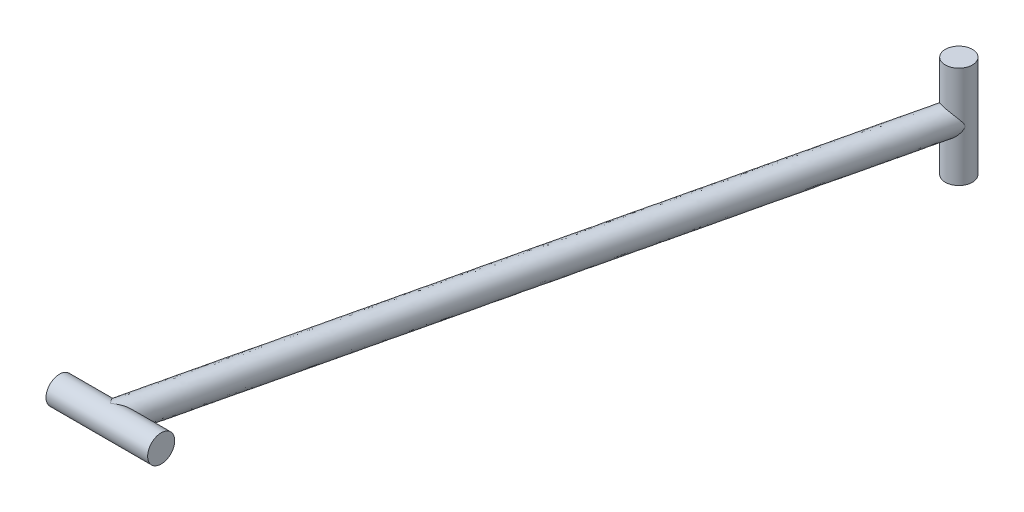
ISO-10303-21;
HEADER;
FILE_DESCRIPTION(('STEP AP214'),'2;1');
FILE_NAME('part.step','',(''),(''),'','','');
FILE_SCHEMA(('AUTOMOTIVE_DESIGN { 1 0 10303 214 1 1 1 1 }'));
ENDSEC;
DATA;
#1=APPLICATION_CONTEXT('core data for automotive mechanical design processes');
#2=APPLICATION_PROTOCOL_DEFINITION('international standard','automotive_design',2000,#1);
#3=PRODUCT_CONTEXT('',#1,'mechanical');
#4=PRODUCT('Part','Part','',(#3));
#5=PRODUCT_RELATED_PRODUCT_CATEGORY('part','',(#4));
#6=PRODUCT_DEFINITION_FORMATION('','',#4);
#7=PRODUCT_DEFINITION_CONTEXT('part definition',#1,'design');
#8=PRODUCT_DEFINITION('design','',#6,#7);
#9=PRODUCT_DEFINITION_SHAPE('','',#8);
#10=(LENGTH_UNIT() NAMED_UNIT(*) SI_UNIT(.MILLI.,.METRE.));
#11=(NAMED_UNIT(*) PLANE_ANGLE_UNIT() SI_UNIT($,.RADIAN.));
#12=(NAMED_UNIT(*) SI_UNIT($,.STERADIAN.) SOLID_ANGLE_UNIT());
#13=UNCERTAINTY_MEASURE_WITH_UNIT(LENGTH_MEASURE(1.E-05),#10,'distance_accuracy_value','');
#14=(GEOMETRIC_REPRESENTATION_CONTEXT(3) GLOBAL_UNCERTAINTY_ASSIGNED_CONTEXT((#13)) GLOBAL_UNIT_ASSIGNED_CONTEXT((#10,
#11,#12)) REPRESENTATION_CONTEXT('',''));
#15=CARTESIAN_POINT('',(0.,0.,0.));
#16=DIRECTION('',(0.,0.,1.));
#17=DIRECTION('',(1.,0.,0.));
#18=AXIS2_PLACEMENT_3D('',#15,#16,#17);
#19=CARTESIAN_POINT('',(23.8512363432151,-7.5,-101.371880346081));
#20=DIRECTION('',(0.,1.,0.));
#21=DIRECTION('',(-1.,0.,0.));
#22=AXIS2_PLACEMENT_3D('',#19,#20,#21);
#23=CYLINDRICAL_SURFACE('',#22,2.);
#24=CARTESIAN_POINT('',(25.8512363432151,0.,-101.371880346081));
#25=VERTEX_POINT('',#24);
#26=VERTEX_LOOP('',#25);
#27=FACE_BOUND('',#26,.T.);
#28=CARTESIAN_POINT('',(23.8512363432151,-7.5,-101.371880346081));
#29=DIRECTION('',(0.,1.,0.));
#30=DIRECTION('',(-1.,0.,0.));
#31=AXIS2_PLACEMENT_3D('',#28,#29,#30);
#32=CIRCLE('',#31,2.);
#33=CARTESIAN_POINT('',(21.8512363432151,-7.5,-101.371880346081));
#34=VERTEX_POINT('',#33);
#35=EDGE_CURVE('E125',#34,#34,#32,.T.);
#36=ORIENTED_EDGE('',*,*,#35,.T.);
#37=EDGE_LOOP('',(#36));
#38=FACE_BOUND('',#37,.T.);
#39=CARTESIAN_POINT('',(23.8512363432151,7.5,-101.371880346081));
#40=DIRECTION('',(0.,1.,0.));
#41=DIRECTION('',(-1.,0.,0.));
#42=AXIS2_PLACEMENT_3D('',#39,#40,#41);
#43=CIRCLE('',#42,2.);
#44=CARTESIAN_POINT('',(21.8512363432151,7.5,-101.371880346081));
#45=VERTEX_POINT('',#44);
#46=EDGE_CURVE('E106',#45,#45,#43,.T.);
#47=ORIENTED_EDGE('',*,*,#46,.F.);
#48=EDGE_LOOP('',(#47));
#49=FACE_BOUND('',#48,.T.);
#50=CARTESIAN_POINT('',(25.6414164622059,0.,-100.480109556264));
#51=CARTESIAN_POINT('',(25.6414164896629,0.0330633130119497,-100.480109685598));
#52=CARTESIAN_POINT('',(25.6398297808977,0.0661271028455549,-100.476903879545));
#53=CARTESIAN_POINT('',(25.6338354164729,0.131099321924574,-100.465028855595));
#54=CARTESIAN_POINT('',(25.6294108859467,0.162999625216193,-100.456326960425));
#55=CARTESIAN_POINT('',(25.6182129756447,0.22615370066255,-100.43489406543));
#56=CARTESIAN_POINT('',(25.611364280809,0.257347828838784,-100.422035180611));
#57=CARTESIAN_POINT('',(25.5959016096659,0.318207313060219,-100.393922461357));
#58=CARTESIAN_POINT('',(25.5872843337629,0.347869679961049,-100.378664163022));
#59=CARTESIAN_POINT('',(25.5685825412208,0.40609216080435,-100.34666431721));
#60=CARTESIAN_POINT('',(25.5584909005276,0.434646018597986,-100.329915731781));
#61=CARTESIAN_POINT('',(25.5370655069417,0.490784072258759,-100.295595006165));
#62=CARTESIAN_POINT('',(25.5257312402196,0.518367860725302,-100.278022527028));
#63=CARTESIAN_POINT('',(25.5009043937179,0.575117644919343,-100.240891168043));
#64=CARTESIAN_POINT('',(25.4873098387017,0.604212664892045,-100.221292426204));
#65=CARTESIAN_POINT('',(25.4588772043875,0.661647269649031,-100.181887745201));
#66=CARTESIAN_POINT('',(25.4440389343604,0.689986737684641,-100.162081774666));
#67=CARTESIAN_POINT('',(25.3977156558814,0.774076112986543,-100.102659748105));
#68=CARTESIAN_POINT('',(25.3644376398722,0.828862269182463,-100.063063069661));
#69=CARTESIAN_POINT('',(25.2933773128712,0.936086930855972,-99.9851546209353));
#70=CARTESIAN_POINT('',(25.2556076837358,0.988531496985108,-99.9468396067338));
#71=CARTESIAN_POINT('',(25.1755246227171,1.09121673022868,-99.8721276434021));
#72=CARTESIAN_POINT('',(25.13321313935,1.14145832951863,-99.8357298816566));
#73=CARTESIAN_POINT('',(25.0106341837346,1.27627484190168,-99.7391990115311));
#74=CARTESIAN_POINT('',(24.92561495809,1.35847569745479,-99.6816351775219));
#75=CARTESIAN_POINT('',(24.7412537820917,1.51347328446554,-99.5777104739691));
#76=CARTESIAN_POINT('',(24.6419272370711,1.586279973204,-99.5313376963897));
#77=CARTESIAN_POINT('',(24.4566912214054,1.70174008261779,-99.4638738948813));
#78=CARTESIAN_POINT('',(24.3738827119407,1.74733625607209,-99.439348773381));
#79=CARTESIAN_POINT('',(24.2014406092943,1.82914438674591,-99.4008069383552));
#80=CARTESIAN_POINT('',(24.1118166333109,1.86536926100591,-99.3867757094239));
#81=CARTESIAN_POINT('',(23.9422840268453,1.92123557432444,-99.3724430681944));
#82=CARTESIAN_POINT('',(23.8631038912654,1.94259997767473,-99.3703096715738));
#83=CARTESIAN_POINT('',(23.7030660868549,1.97570570071809,-99.3757739966267));
#84=CARTESIAN_POINT('',(23.6222094446811,1.98745274125164,-99.3833659263346));
#85=CARTESIAN_POINT('',(23.4609348711303,2.00048085693559,-99.4086315615333));
#86=CARTESIAN_POINT('',(23.3805192308502,2.00172767086771,-99.4263380694187));
#87=CARTESIAN_POINT('',(23.2229866475399,1.9935628518087,-99.4713503463768));
#88=CARTESIAN_POINT('',(23.1458700643559,1.98415005917641,-99.4986571596281));
#89=CARTESIAN_POINT('',(23.0008526232865,1.95611522798826,-99.5600449493896));
#90=CARTESIAN_POINT('',(22.9326843305949,1.93797347519617,-99.5937224208468));
#91=CARTESIAN_POINT('',(22.8024647668539,1.89378381594142,-99.6672753008752));
#92=CARTESIAN_POINT('',(22.740420849738,1.86772655421533,-99.7071580160061));
#93=CARTESIAN_POINT('',(22.6408259289404,1.81782052448513,-99.7789382538994));
#94=CARTESIAN_POINT('',(22.6015213417867,1.79566523636326,-99.8096289697726));
#95=CARTESIAN_POINT('',(22.5263269794008,1.74853549898356,-99.872872278598));
#96=CARTESIAN_POINT('',(22.4904341509944,1.7235636149033,-99.9054231643046));
#97=CARTESIAN_POINT('',(22.3876750720484,1.64485574178421,-100.005447263154));
#98=CARTESIAN_POINT('',(22.3258532692708,1.58739248186293,-100.075199397426));
#99=CARTESIAN_POINT('',(22.193790583975,1.44162126804772,-100.245586332518));
#100=CARTESIAN_POINT('',(22.1293899197793,1.34992772153495,-100.347819554426));
#101=CARTESIAN_POINT('',(22.0491803803215,1.20494742461934,-100.502410853279));
#102=CARTESIAN_POINT('',(22.0251543544892,1.15530822264227,-100.554219352363));
#103=CARTESIAN_POINT('',(21.9822412576117,1.05376056711014,-100.657743240233));
#104=CARTESIAN_POINT('',(21.963352526476,1.00185285292152,-100.70945865372));
#105=CARTESIAN_POINT('',(21.9338605905439,0.907007100286012,-100.801367396172));
#106=CARTESIAN_POINT('',(21.9223503455336,0.86447724152798,-100.841697581549));
#107=CARTESIAN_POINT('',(21.9021664034404,0.777949732967088,-100.921523592375));
#108=CARTESIAN_POINT('',(21.8934938517243,0.73395149836598,-100.961019074913));
#109=CARTESIAN_POINT('',(21.8788290947928,0.644343912598489,-101.038481547172));
#110=CARTESIAN_POINT('',(21.8728312857652,0.598738147865237,-101.076451579421));
#111=CARTESIAN_POINT('',(21.865652049047,0.528653929329881,-101.131466714281));
#112=CARTESIAN_POINT('',(21.8635623519017,0.505022965397859,-101.149475015373));
#113=CARTESIAN_POINT('',(21.8599454896835,0.457071410239245,-101.184604380358));
#114=CARTESIAN_POINT('',(21.858418226635,0.432750939919934,-101.201725598333));
#115=CARTESIAN_POINT('',(21.8553547245486,0.373143728383263,-101.241504981005));
#116=CARTESIAN_POINT('',(21.8540700286709,0.337438208318554,-101.263565530174));
#117=CARTESIAN_POINT('',(21.8523011296765,0.263771585135846,-101.303637557736));
#118=CARTESIAN_POINT('',(21.8518154437818,0.225814795844698,-101.321656482634));
#119=CARTESIAN_POINT('',(21.8513721615968,0.158970404662672,-101.346375695456));
#120=CARTESIAN_POINT('',(21.8513001067132,0.130763378886722,-101.35484930148));
#121=CARTESIAN_POINT('',(21.8512325204918,0.0733687412123095,-101.36701368639));
#122=CARTESIAN_POINT('',(21.8512367440805,0.0441845703223844,-101.370719741743));
#123=CARTESIAN_POINT('',(21.8512359680219,-0.01453680441229,-101.372574077925));
#124=CARTESIAN_POINT('',(21.8512309161016,-0.0440750713287584,-101.370690822774));
#125=CARTESIAN_POINT('',(21.8512578222769,-0.102382929144676,-101.361738537585));
#126=CARTESIAN_POINT('',(21.8512898769814,-0.131150313120694,-101.354655988525));
#127=CARTESIAN_POINT('',(21.8515040220253,-0.181788834815861,-101.338378304777));
#128=CARTESIAN_POINT('',(21.8516551143533,-0.203896684414685,-101.329880162518));
#129=CARTESIAN_POINT('',(21.8521407931181,-0.247301824660974,-101.311001875697));
#130=CARTESIAN_POINT('',(21.8524755319634,-0.268598426331823,-101.300620172763));
#131=CARTESIAN_POINT('',(21.8533898450298,-0.310537589757773,-101.278428599797));
#132=CARTESIAN_POINT('',(21.8539704965909,-0.331176838651411,-101.266612610657));
#133=CARTESIAN_POINT('',(21.8554226810484,-0.371807695422043,-101.241954467136));
#134=CARTESIAN_POINT('',(21.8562941277043,-0.391799493386178,-101.229112617851));
#135=CARTESIAN_POINT('',(21.8590258893691,-0.443857569873749,-101.194204365618));
#136=CARTESIAN_POINT('',(21.86116222872,-0.475472860510501,-101.171488941949));
#137=CARTESIAN_POINT('',(21.8664275804825,-0.537617032690497,-101.12471602923));
#138=CARTESIAN_POINT('',(21.8695570714889,-0.568145382537405,-101.100657897751));
#139=CARTESIAN_POINT('',(21.8768922842518,-0.628369420676744,-101.051596743545));
#140=CARTESIAN_POINT('',(21.8810994919512,-0.658063895998619,-101.026592457169));
#141=CARTESIAN_POINT('',(21.8906497458481,-0.716717333594742,-100.975944131473));
#142=CARTESIAN_POINT('',(21.895992942906,-0.74567619760673,-100.950300007581));
#143=CARTESIAN_POINT('',(21.9138302619363,-0.831698329931916,-100.872599655411));
#144=CARTESIAN_POINT('',(21.9281188155123,-0.887795241216367,-100.81986883412));
#145=CARTESIAN_POINT('',(21.9618246415138,-0.997606029852399,-100.713676643988));
#146=CARTESIAN_POINT('',(21.9812378486254,-1.05132175688783,-100.660215885933));
#147=CARTESIAN_POINT('',(22.0267555609819,-1.15916418616672,-100.550302488454));
#148=CARTESIAN_POINT('',(22.0531627453682,-1.21315882662256,-100.493842955466));
#149=CARTESIAN_POINT('',(22.11248832687,-1.31809445657913,-100.381524608059));
#150=CARTESIAN_POINT('',(22.1454098153901,-1.36903398124135,-100.325666092177));
#151=CARTESIAN_POINT('',(22.2543878276713,-1.51600772814544,-100.160536231729));
#152=CARTESIAN_POINT('',(22.340935007836,-1.6068949213317,-100.052994648646));
#153=CARTESIAN_POINT('',(22.5004225512203,-1.73223217298269,-99.8947335789992));
#154=CARTESIAN_POINT('',(22.5631612041835,-1.77412723287512,-99.8394944250851));
#155=CARTESIAN_POINT('',(22.6985893217725,-1.84894565019525,-99.7352166660919));
#156=CARTESIAN_POINT('',(22.7712738716604,-1.88187341490558,-99.6861750214112));
#157=CARTESIAN_POINT('',(22.887350835103,-1.92304000139374,-99.6188930236413));
#158=CARTESIAN_POINT('',(22.9274543372925,-1.93543561513494,-99.5974137228463));
#159=CARTESIAN_POINT('',(23.0097008951446,-1.95713972089325,-99.556966202197));
#160=CARTESIAN_POINT('',(23.0518428261892,-1.96644989340579,-99.5379966188109));
#161=CARTESIAN_POINT('',(23.1378371569078,-1.9817653316971,-99.5028654467819));
#162=CARTESIAN_POINT('',(23.1816884942766,-1.98777261605786,-99.4867021472026));
#163=CARTESIAN_POINT('',(23.2707048000639,-1.99634658835593,-99.4574136257441));
#164=CARTESIAN_POINT('',(23.3158695662887,-1.99891380303404,-99.4442879390027));
#165=CARTESIAN_POINT('',(23.4402440767364,-2.00110997591624,-99.4128869924573));
#166=CARTESIAN_POINT('',(23.5203702420451,-1.99725370641019,-99.3977891576926));
#167=CARTESIAN_POINT('',(23.6806674150554,-1.97931955668715,-99.3775256278309));
#168=CARTESIAN_POINT('',(23.7608384255553,-1.96524094512834,-99.372360643461));
#169=CARTESIAN_POINT('',(23.9167402683661,-1.92841221978288,-99.3714768974999));
#170=CARTESIAN_POINT('',(23.9925325097181,-1.90592184366401,-99.3754919891986));
#171=CARTESIAN_POINT('',(24.1405664126012,-1.85349818634133,-99.3915161268252));
#172=CARTESIAN_POINT('',(24.212806933613,-1.82356253278511,-99.4035277227972));
#173=CARTESIAN_POINT('',(24.385730572449,-1.74197899487784,-99.4417461958544));
#174=CARTESIAN_POINT('',(24.4838326074107,-1.68673771109214,-99.4719708429538));
#175=CARTESIAN_POINT('',(24.6691715333106,-1.56629776448547,-99.5440614904245));
#176=CARTESIAN_POINT('',(24.756377499942,-1.50107188003319,-99.5859595809886));
#177=CARTESIAN_POINT('',(24.8945933282351,-1.38432310570896,-99.6643535806901));
#178=CARTESIAN_POINT('',(24.948532758408,-1.33468523000336,-99.6986020660752));
#179=CARTESIAN_POINT('',(25.0510487712397,-1.23240290219126,-99.7705149870878));
#180=CARTESIAN_POINT('',(25.0996237333861,-1.17975754882551,-99.8081804486998));
#181=CARTESIAN_POINT('',(25.1914016304663,-1.07191480816491,-99.8860892952446));
#182=CARTESIAN_POINT('',(25.2346103938422,-1.01672028065607,-99.9263298100095));
#183=CARTESIAN_POINT('',(25.3157621285002,-0.903832164618239,-100.008611464032));
#184=CARTESIAN_POINT('',(25.3537034951579,-0.84613782155455,-100.050653146905));
#185=CARTESIAN_POINT('',(25.4200911487283,-0.734943171382799,-100.130486815443));
#186=CARTESIAN_POINT('',(25.4491289465506,-0.68174142804855,-100.168200814423));
#187=CARTESIAN_POINT('',(25.4893143796403,-0.599929276978173,-100.224173778835));
#188=CARTESIAN_POINT('',(25.5021424008579,-0.572337096096337,-100.242723171139));
#189=CARTESIAN_POINT('',(25.5266062300812,-0.516316163463138,-100.279351597522));
#190=CARTESIAN_POINT('',(25.538242045575,-0.48788741696771,-100.297430634555));
#191=CARTESIAN_POINT('',(25.5570557587924,-0.438251221395393,-100.327657736877));
#192=CARTESIAN_POINT('',(25.5645576446342,-0.417300600209389,-100.340024846713));
#193=CARTESIAN_POINT('',(25.5788085723921,-0.374758034971738,-100.364066334845));
#194=CARTESIAN_POINT('',(25.5855577975705,-0.353166248663301,-100.375740881447));
#195=CARTESIAN_POINT('',(25.5981891174925,-0.30921830564263,-100.398063023031));
#196=CARTESIAN_POINT('',(25.6040717406282,-0.286862625029668,-100.408711242414));
#197=CARTESIAN_POINT('',(25.6148015996771,-0.24126403000401,-100.428501144219));
#198=CARTESIAN_POINT('',(25.6196495304625,-0.218021723468872,-100.437643836764));
#199=CARTESIAN_POINT('',(25.6293829546324,-0.16319608301723,-100.456273243452));
#200=CARTESIAN_POINT('',(25.633818102221,-0.131252673006746,-100.46499497954));
#201=CARTESIAN_POINT('',(25.6398260899096,-0.0662007265207565,-100.476896126455));
#202=CARTESIAN_POINT('',(25.641416434718,-0.0331006022092744,-100.480109426784));
#203=CARTESIAN_POINT('',(25.6414164622059,0.,-100.480109556264));
#204=B_SPLINE_CURVE_WITH_KNOTS('',3,(#50,#51,#52,#53,#54,#55,#56,#57,#58,#59,#60,#61,#62,#63,
#64,#65,#66,#67,#68,#69,#70,#71,#72,#73,#74,#75,#76,#77,#78,#79,#80,#81,#82,#83,#84,#85,#86,#87,
#88,#89,#90,#91,#92,#93,#94,#95,#96,#97,#98,#99,#100,#101,#102,#103,#104,#105,#106,#107,#108,
#109,#110,#111,#112,#113,#114,#115,#116,#117,#118,#119,#120,#121,#122,#123,#124,#125,#126,#127,
#128,#129,#130,#131,#132,#133,#134,#135,#136,#137,#138,#139,#140,#141,#142,#143,#144,#145,#146,
#147,#148,#149,#150,#151,#152,#153,#154,#155,#156,#157,#158,#159,#160,#161,#162,#163,#164,#165,
#166,#167,#168,#169,#170,#171,#172,#173,#174,#175,#176,#177,#178,#179,#180,#181,#182,#183,#184,
#185,#186,#187,#188,#189,#190,#191,#192,#193,#194,#195,#196,#197,#198,#199,#200,#201,#202,#203),
.UNSPECIFIED.,.T.,.F.,(4,2,2,2,2,2,2,2,2,2,2,2,2,2,2,2,2,2,2,2,2,2,2,2,2,2,2,2,2,2,2,2,2,2,2,2,
2,2,2,2,2,2,2,2,2,2,2,2,2,2,2,2,2,2,2,2,2,2,2,2,2,2,2,2,2,2,2,2,2,2,2,2,2,2,2,2,4),(0.,
0.0990434605695672,0.198681404838483,0.301734735919303,0.404982107769672,0.508745961866879,
0.61255288561044,0.725386043902423,0.838236537410784,1.06407124957604,1.28928282636853,
1.51439816763924,1.90759602723141,2.30037363465985,2.59232510049995,2.88387198130991,
3.12894748404239,3.37387709869241,3.61960558646405,3.8653608092037,4.09891808839242,
4.33275248780027,4.4962474671304,4.65959472989868,4.98678838133903,5.43926482201365,
5.66611960267548,5.89290098904243,6.0720109339905,6.25119308344739,6.42999804695031,
6.51932969616771,6.60864577650143,6.73447284783371,6.86006614868269,6.94811730007276,
7.03588560421349,7.12415005393378,7.21264482235421,7.28359898372849,7.35461211934179,
7.42593963423194,7.49724601443106,7.61413573855463,7.73108187701015,7.84819013555353,
7.96531395590972,8.19999960235473,8.43449963262687,8.68155863882773,8.92873517086058,
9.42001654769625,9.6996429999009,9.97913177111372,10.120411365752,10.2616138850583,
10.4027300113109,10.5438245275017,10.7873311452642,11.0308551860517,11.2674088641937,
11.5040380142422,11.8518299107155,12.2005874809715,12.443016928878,12.6855194113301,
12.927756154847,13.1700665305726,13.384039924669,13.4909260529089,13.597811509753,
13.6741660636802,13.7505019855594,13.8267911688582,13.9030289560064,14.0028001733479,
14.1019553363093),.UNSPECIFIED.);
#205=CARTESIAN_POINT('',(25.6414164622059,0.,-100.480109556264));
#206=VERTEX_POINT('',#205);
#207=EDGE_CURVE('E75',#206,#206,#204,.T.);
#208=ORIENTED_EDGE('',*,*,#207,.F.);
#209=EDGE_LOOP('',(#208));
#210=FACE_BOUND('',#209,.T.);
#211=ADVANCED_FACE('F45',(#27,#38,#49,#210),#23,.T.);
#212=CARTESIAN_POINT('',(23.8512363432151,-7.5,-101.371880346081));
#213=DIRECTION('',(0.,1.,0.));
#214=DIRECTION('',(-1.,0.,0.));
#215=AXIS2_PLACEMENT_3D('',#212,#213,#214);
#216=PLANE('',#215);
#217=ORIENTED_EDGE('',*,*,#35,.F.);
#218=EDGE_LOOP('',(#217));
#219=FACE_BOUND('',#218,.T.);
#220=ADVANCED_FACE('F79',(#219),#216,.F.);
#221=CARTESIAN_POINT('',(23.8512363432151,7.5,-101.371880346081));
#222=DIRECTION('',(0.,1.,0.));
#223=DIRECTION('',(-1.,0.,0.));
#224=AXIS2_PLACEMENT_3D('',#221,#222,#223);
#225=PLANE('',#224);
#226=ORIENTED_EDGE('',*,*,#46,.T.);
#227=EDGE_LOOP('',(#226));
#228=FACE_BOUND('',#227,.T.);
#229=ADVANCED_FACE('F77',(#228),#225,.T.);
#230=CARTESIAN_POINT('',(2.,0.,0.));
#231=CARTESIAN_POINT('',(25.8512363432151,0.,-101.371880346081));
#232=CARTESIAN_POINT('',(2.,4.,0.));
#233=CARTESIAN_POINT('',(25.8512363432151,4.,-101.371880346081));
#234=CARTESIAN_POINT('',(-2.,4.,0.));
#235=CARTESIAN_POINT('',(21.8512363432151,4.,-101.371880346081));
#236=CARTESIAN_POINT('',(-2.,0.,0.));
#237=CARTESIAN_POINT('',(21.8512363432151,0.,-101.371880346081));
#238=CARTESIAN_POINT('',(-2.,-4.,0.));
#239=CARTESIAN_POINT('',(21.8512363432151,-4.,-101.371880346081));
#240=CARTESIAN_POINT('',(2.,-4.,0.));
#241=CARTESIAN_POINT('',(25.8512363432151,-4.,-101.371880346081));
#242=CARTESIAN_POINT('',(2.,0.,0.));
#243=CARTESIAN_POINT('',(25.8512363432151,0.,-101.371880346081));
#244=(BOUNDED_SURFACE() B_SPLINE_SURFACE(3,1,((#230,#231),(#232,#233),(#234,#235),(#236,#237),
(#238,#239),(#240,#241),(#242,#243)),.UNSPECIFIED.,.T.,.F.,.F.) B_SPLINE_SURFACE_WITH_KNOTS((4,
3,4),(2,2),(0.,0.5,1.),(0.,1.),
.UNSPECIFIED.) GEOMETRIC_REPRESENTATION_ITEM() RATIONAL_B_SPLINE_SURFACE(((1.,1.),
(0.333333333333333,0.333333333333333),(0.333333333333333,0.333333333333333),(1.,1.),
(0.333333333333333,0.333333333333333),(0.333333333333333,0.333333333333333),(1.,1.))) REPRESENTATION_ITEM('') SURFACE());
#245=CARTESIAN_POINT('',(0.,-2.,0.));
#246=CARTESIAN_POINT('',(0.00234955513881044,-1.99999999579181,-0.00190203557211533));
#247=CARTESIAN_POINT('',(0.00469913541317584,-1.99999728267501,-0.00380409149221877));
#248=CARTESIAN_POINT('',(0.114305847395802,-1.99974431551953,-0.0925340224012214));
#249=CARTESIAN_POINT('',(0.221605963155561,-1.99385029488185,-0.179396694272455));
#250=CARTESIAN_POINT('',(0.435533626753908,-1.97061731010082,-0.352577574056759));
#251=CARTESIAN_POINT('',(0.542160474227306,-1.95326794288155,-0.438895215003144));
#252=CARTESIAN_POINT('',(0.75399354030323,-1.90665700219048,-0.610380455056205));
#253=CARTESIAN_POINT('',(0.859197799890242,-1.87738044869279,-0.695546468280848));
#254=CARTESIAN_POINT('',(1.06691720227247,-1.80619737040046,-0.863701573827866));
#255=CARTESIAN_POINT('',(1.16943473123542,-1.76430249618628,-0.946692597824771));
#256=CARTESIAN_POINT('',(1.37823177649764,-1.66301554170228,-1.11572008772201));
#257=CARTESIAN_POINT('',(1.48419499935633,-1.60252628288114,-1.20150050456425));
#258=CARTESIAN_POINT('',(1.68879949680379,-1.46376085577807,-1.36713400084901));
#259=CARTESIAN_POINT('',(1.78745377944107,-1.38551734596174,-1.44699761069812));
#260=CARTESIAN_POINT('',(1.95096747029362,-1.23018515465675,-1.57936686281708));
#261=CARTESIAN_POINT('',(2.01824774622282,-1.15734599331362,-1.63383227033467));
#262=CARTESIAN_POINT('',(2.14331923004924,-0.999137436488175,-1.73508139931619));
#263=CARTESIAN_POINT('',(2.20112540831798,-0.913788220938408,-1.78187723974626));
#264=CARTESIAN_POINT('',(2.28960464033582,-0.754959309871377,-1.85350383999673));
#265=CARTESIAN_POINT('',(2.32340371136049,-0.684372909833265,-1.88086520484923));
#266=CARTESIAN_POINT('',(2.3817481156476,-0.537023356085348,-1.92809675543377));
#267=CARTESIAN_POINT('',(2.40630112231192,-0.460265388714408,-1.94797315301546));
#268=CARTESIAN_POINT('',(2.43481334116963,-0.341472496961224,-1.97105465198179));
#269=CARTESIAN_POINT('',(2.44295116519852,-0.301048566153884,-1.97764246536263));
#270=CARTESIAN_POINT('',(2.45618506138068,-0.219392147790795,-1.98835570246895));
#271=CARTESIAN_POINT('',(2.46128267146704,-0.178160079964029,-1.99248237119754));
#272=CARTESIAN_POINT('',(2.46829827471774,-0.0952622909830991,-1.9981617130962));
#273=CARTESIAN_POINT('',(2.47021736660834,-0.0535967246911198,-1.99971527571824));
#274=CARTESIAN_POINT('',(2.47083306251864,0.029760033811994,-2.00021370008106));
#275=CARTESIAN_POINT('',(2.46953000722866,0.0714512228479476,-1.9991588376209));
#276=CARTESIAN_POINT('',(2.46159086055835,0.1849065443484,-1.99273185953898));
#277=CARTESIAN_POINT('',(2.4517483118717,0.256336944772661,-1.98476402026023));
#278=CARTESIAN_POINT('',(2.42321001250166,0.396140146688179,-1.96166140833437));
#279=CARTESIAN_POINT('',(2.404510533497,0.464511647259032,-1.94652361749901));
#280=CARTESIAN_POINT('',(2.35297266675574,0.61608021842675,-1.90480216383522));
#281=CARTESIAN_POINT('',(2.31761037552674,0.697854695606116,-1.87617532519706));
#282=CARTESIAN_POINT('',(2.23706669291774,0.852931844130472,-1.81097279093716));
#283=CARTESIAN_POINT('',(2.191867585893,0.926218860291071,-1.77438275396802));
#284=CARTESIAN_POINT('',(2.07264114293744,1.09447665043642,-1.67786536142141));
#285=CARTESIAN_POINT('',(1.99467874201404,1.18480457177616,-1.61475245234429));
#286=CARTESIAN_POINT('',(1.82884575938038,1.34884444519679,-1.48050566375398));
#287=CARTESIAN_POINT('',(1.74095358510599,1.42251909911982,-1.4093543044105));
#288=CARTESIAN_POINT('',(1.5794861170742,1.53977696535873,-1.27864153122286));
#289=CARTESIAN_POINT('',(1.50721207693169,1.5863915959796,-1.22013352133043));
#290=CARTESIAN_POINT('',(1.35978289916807,1.67142000813592,-1.10078516646712));
#291=CARTESIAN_POINT('',(1.28462650717473,1.70983017027933,-1.0399438060442));
#292=CARTESIAN_POINT('',(1.13219896349268,1.77902858529836,-0.916549123593926));
#293=CARTESIAN_POINT('',(1.05492678163604,1.80981304924559,-0.85399496761462));
#294=CARTESIAN_POINT('',(0.898865093231656,1.86420012813593,-0.727658335673244));
#295=CARTESIAN_POINT('',(0.820075224932629,1.88780100772256,-0.663875566862616));
#296=CARTESIAN_POINT('',(0.620022022849436,1.93870497043121,-0.501926481097871));
#297=CARTESIAN_POINT('',(0.498059680356819,1.96150807784274,-0.40319429556264));
#298=CARTESIAN_POINT('',(0.253060052210259,1.99200558955569,-0.204859725670022));
#299=CARTESIAN_POINT('',(0.130023380143999,1.9997081153264,-0.10525783803032));
#300=CARTESIAN_POINT('',(0.00469913343712041,1.99999728124399,-0.00380408989260247));
#301=CARTESIAN_POINT('',(0.00234955319318854,1.99999999432182,-0.0019020339971066));
#302=CARTESIAN_POINT('',(0.,2.,0.));
#303=B_SPLINE_CURVE_WITH_KNOTS('',3,(#245,#246,#247,#248,#249,#250,#251,#252,#253,#254,#255,
#256,#257,#258,#259,#260,#261,#262,#263,#264,#265,#266,#267,#268,#269,#270,#271,#272,#273,#274,
#275,#276,#277,#278,#279,#280,#281,#282,#283,#284,#285,#286,#287,#288,#289,#290,#291,#292,#293,
#294,#295,#296,#297,#298,#299,#300,#301,#302),.UNSPECIFIED.,.F.,.F.,(4,2,2,2,2,2,2,2,2,2,2,2,2,
2,2,2,2,2,2,2,2,2,2,2,2,2,2,2,4),(0.,0.00906890616271831,0.423056094701282,0.83741976024521,
1.25230546081097,1.66680926284259,2.1131656634072,2.5587075654453,2.89707670766542,
3.23490591502497,3.48275561456669,3.73039916544542,3.8555115141757,3.98056051934222,
4.10556628948098,4.23055884283189,4.44707817612058,4.66368873424956,4.94287102257799,
5.22256032837337,5.62528247558535,6.02889785028787,6.34054353548837,6.65232642018229,
6.96426390896722,7.27627669357587,7.75118494533727,8.22583770945472,8.23490661561744),.UNSPECIFIED.);
#304=CARTESIAN_POINT('',(0.,2.,0.));
#305=VERTEX_POINT('',#304);
#306=CARTESIAN_POINT('',(0.,-2.,0.));
#307=VERTEX_POINT('',#306);
#308=EDGE_CURVE('E62',#305,#307,#303,.F.);
#309=CARTESIAN_POINT('',(0.,-2.,0.));
#310=CARTESIAN_POINT('',(-0.00183626629601518,-1.99999999871563,-0.00240124123883865));
#311=CARTESIAN_POINT('',(-0.0036725856355241,-1.99999567429728,-0.00480255184137324));
#312=CARTESIAN_POINT('',(-0.102844046308543,-1.99952862079514,-0.134486684039384));
#313=CARTESIAN_POINT('',(-0.200303776800228,-1.98692203949555,-0.261932427869157));
#314=CARTESIAN_POINT('',(-0.392972800253455,-1.93712095700827,-0.513881072551322));
#315=CARTESIAN_POINT('',(-0.488180010582819,-1.89990455676681,-0.638381249995756));
#316=CARTESIAN_POINT('',(-0.622991915498753,-1.82752719879315,-0.814671533336228));
#317=CARTESIAN_POINT('',(-0.664614896488375,-1.80230515234881,-0.869100903776422));
#318=CARTESIAN_POINT('',(-0.746497999740568,-1.74663098811575,-0.976177467044092));
#319=CARTESIAN_POINT('',(-0.786759376237294,-1.71618384966646,-1.02882630000344));
#320=CARTESIAN_POINT('',(-0.905012938500821,-1.61690607987328,-1.18346363712483));
#321=CARTESIAN_POINT('',(-0.98063488523514,-1.54005488415088,-1.2823526368503));
#322=CARTESIAN_POINT('',(-1.10786593325078,-1.38258738463235,-1.4487296161048));
#323=CARTESIAN_POINT('',(-1.16124648291537,-1.30583235979261,-1.51853407607527));
#324=CARTESIAN_POINT('',(-1.2597381691381,-1.1390212681247,-1.6473292835763));
#325=CARTESIAN_POINT('',(-1.3048580436152,-1.04897943999628,-1.70633145747311));
#326=CARTESIAN_POINT('',(-1.3782103096422,-0.87199196485286,-1.80225245027488));
#327=CARTESIAN_POINT('',(-1.4079818379353,-0.78677930408005,-1.84118396125779));
#328=CARTESIAN_POINT('',(-1.45850860680442,-0.609355850350097,-1.90725660079568));
#329=CARTESIAN_POINT('',(-1.47926830572276,-0.517148544376725,-1.93440355941762));
#330=CARTESIAN_POINT('',(-1.510598328267,-0.32762765370532,-1.97537307582752));
#331=CARTESIAN_POINT('',(-1.52111923022737,-0.230291669365535,-1.98913100609295));
#332=CARTESIAN_POINT('',(-1.53105355136112,-0.0340951973078837,-2.00212187873392));
#333=CARTESIAN_POINT('',(-1.53047024981168,0.0647648317141512,-2.00135910934131));
#334=CARTESIAN_POINT('',(-1.51876917044157,0.252364160860951,-1.98605788947824));
#335=CARTESIAN_POINT('',(-1.50853702664846,0.341258096956273,-1.97267756131031));
#336=CARTESIAN_POINT('',(-1.47940533658505,0.515081117041564,-1.93458275137455));
#337=CARTESIAN_POINT('',(-1.46050521405472,0.600009937011081,-1.90986751604534));
#338=CARTESIAN_POINT('',(-1.41431928148018,0.766510842275977,-1.84947128365004));
#339=CARTESIAN_POINT('',(-1.38679737363712,0.847903992943279,-1.81348154717472));
#340=CARTESIAN_POINT('',(-1.32482412824854,1.00315947206111,-1.73244062579402));
#341=CARTESIAN_POINT('',(-1.29036996748965,1.07701871374098,-1.68738574904047));
#342=CARTESIAN_POINT('',(-1.21051614373843,1.22623179846981,-1.58296282568461));
#343=CARTESIAN_POINT('',(-1.16425876552707,1.30033754316175,-1.52247316553128));
#344=CARTESIAN_POINT('',(-1.06594093761868,1.43731412109303,-1.39390530835407));
#345=CARTESIAN_POINT('',(-1.0138736707446,1.50017152589195,-1.32581819667188));
#346=CARTESIAN_POINT('',(-0.894508389898861,1.62594160019991,-1.16972709187104));
#347=CARTESIAN_POINT('',(-0.826243699888613,1.68636550663903,-1.08045899975446));
#348=CARTESIAN_POINT('',(-0.685274768129683,1.79115459865991,-0.896117320619401));
#349=CARTESIAN_POINT('',(-0.612565400079609,1.8355008163898,-0.801037030060048));
#350=CARTESIAN_POINT('',(-0.452105918479413,1.91442520272534,-0.59120802803031));
#351=CARTESIAN_POINT('',(-0.363848370674581,1.94619860773336,-0.475795756992561));
#352=CARTESIAN_POINT('',(-0.185527906151363,1.98875916275537,-0.242610377462474));
#353=CARTESIAN_POINT('',(-0.0954665088947865,1.99956328227079,-0.124839255933756));
#354=CARTESIAN_POINT('',(-0.00367258666833825,1.99999567599587,-0.0048025531920727));
#355=CARTESIAN_POINT('',(-0.00183626727046971,2.00000000046856,-0.00240124251316612));
#356=CARTESIAN_POINT('',(0.,2.,0.));
#357=B_SPLINE_CURVE_WITH_KNOTS('',3,(#309,#310,#311,#312,#313,#314,#315,#316,#317,#318,#319,
#320,#321,#322,#323,#324,#325,#326,#327,#328,#329,#330,#331,#332,#333,#334,#335,#336,#337,#338,
#339,#340,#341,#342,#343,#344,#345,#346,#347,#348,#349,#350,#351,#352,#353,#354,#355,#356),
.UNSPECIFIED.,.F.,.F.,(4,2,2,2,2,2,2,2,2,2,2,2,2,2,2,2,2,2,2,2,2,2,2,4),(0.,0.00906891179005972,
0.48975985970823,0.970879127236861,1.18972685780369,1.40836718023879,1.84482573911752,
2.19356082395283,2.54192486768565,2.83560065973162,3.12913099812378,3.42407125298914,
3.71892440788023,3.98910356921907,4.25930069507214,4.5376610454736,4.81613499057362,
5.13373582555976,5.45171332396357,5.83310252481673,6.21494022127432,6.65955729034801,
7.10381440051498,7.11288331230504),.UNSPECIFIED.);
#358=EDGE_CURVE('E11',#307,#305,#357,.T.);
#359=ORIENTED_EDGE('',*,*,#207,.T.);
#360=EDGE_LOOP('',(#359));
#361=FACE_BOUND('',#360,.T.);
#362=ORIENTED_EDGE('',*,*,#308,.T.);
#363=ORIENTED_EDGE('',*,*,#358,.T.);
#364=EDGE_LOOP('',(#362,#363));
#365=FACE_BOUND('',#364,.T.);
#366=ADVANCED_FACE('F47',(#361,#365),#244,.F.);
#367=CARTESIAN_POINT('',(-7.5,0.,0.));
#368=DIRECTION('',(1.,0.,0.));
#369=DIRECTION('',(0.,1.,0.));
#370=AXIS2_PLACEMENT_3D('',#367,#368,#369);
#371=CYLINDRICAL_SURFACE('',#370,2.);
#372=CARTESIAN_POINT('',(-7.5,0.,0.));
#373=DIRECTION('',(1.,0.,0.));
#374=DIRECTION('',(0.,1.,0.));
#375=AXIS2_PLACEMENT_3D('',#372,#373,#374);
#376=CIRCLE('',#375,2.);
#377=CARTESIAN_POINT('',(-7.5,2.,0.));
#378=VERTEX_POINT('',#377);
#379=EDGE_CURVE('E126',#378,#378,#376,.T.);
#380=ORIENTED_EDGE('',*,*,#379,.T.);
#381=EDGE_LOOP('',(#380));
#382=FACE_BOUND('',#381,.T.);
#383=CARTESIAN_POINT('',(7.5,0.,0.));
#384=DIRECTION('',(1.,0.,0.));
#385=DIRECTION('',(0.,1.,0.));
#386=AXIS2_PLACEMENT_3D('',#383,#384,#385);
#387=CIRCLE('',#386,2.);
#388=CARTESIAN_POINT('',(7.5,2.,0.));
#389=VERTEX_POINT('',#388);
#390=EDGE_CURVE('E122',#389,#389,#387,.T.);
#391=ORIENTED_EDGE('',*,*,#390,.F.);
#392=EDGE_LOOP('',(#391));
#393=FACE_BOUND('',#392,.T.);
#394=ORIENTED_EDGE('',*,*,#358,.F.);
#395=ORIENTED_EDGE('',*,*,#308,.F.);
#396=EDGE_LOOP('',(#394,#395));
#397=FACE_BOUND('',#396,.T.);
#398=ADVANCED_FACE('F72',(#382,#393,#397),#371,.T.);
#399=CARTESIAN_POINT('',(-7.5,0.,0.));
#400=DIRECTION('',(1.,0.,0.));
#401=DIRECTION('',(0.,1.,0.));
#402=AXIS2_PLACEMENT_3D('',#399,#400,#401);
#403=PLANE('',#402);
#404=ORIENTED_EDGE('',*,*,#379,.F.);
#405=EDGE_LOOP('',(#404));
#406=FACE_BOUND('',#405,.T.);
#407=ADVANCED_FACE('F84',(#406),#403,.F.);
#408=CARTESIAN_POINT('',(7.5,0.,0.));
#409=DIRECTION('',(1.,0.,0.));
#410=DIRECTION('',(0.,1.,0.));
#411=AXIS2_PLACEMENT_3D('',#408,#409,#410);
#412=PLANE('',#411);
#413=ORIENTED_EDGE('',*,*,#390,.T.);
#414=EDGE_LOOP('',(#413));
#415=FACE_BOUND('',#414,.T.);
#416=ADVANCED_FACE('F86',(#415),#412,.T.);
#417=CLOSED_SHELL('',(#211,#220,#229,#366,#398,#407,#416));
#418=MANIFOLD_SOLID_BREP('B2',#417);
#419=ADVANCED_BREP_SHAPE_REPRESENTATION('',(#18,#418),#14);
#420=SHAPE_DEFINITION_REPRESENTATION(#9,#419);
ENDSEC;
END-ISO-10303-21;
